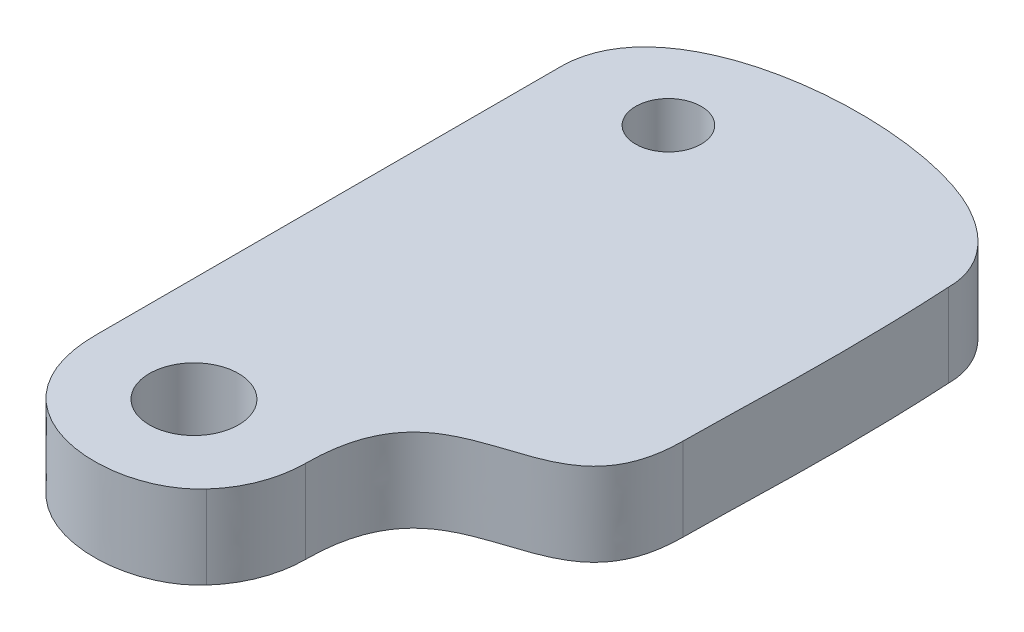
ISO-10303-21;
HEADER;
FILE_DESCRIPTION(('STEP AP214'),'2;1');
FILE_NAME('part.step','',(''),(''),'','','');
FILE_SCHEMA(('AUTOMOTIVE_DESIGN { 1 0 10303 214 1 1 1 1 }'));
ENDSEC;
DATA;
#1=APPLICATION_CONTEXT('core data for automotive mechanical design processes');
#2=APPLICATION_PROTOCOL_DEFINITION('international standard','automotive_design',2000,#1);
#3=PRODUCT_CONTEXT('',#1,'mechanical');
#4=PRODUCT('Part','Part','',(#3));
#5=PRODUCT_RELATED_PRODUCT_CATEGORY('part','',(#4));
#6=PRODUCT_DEFINITION_FORMATION('','',#4);
#7=PRODUCT_DEFINITION_CONTEXT('part definition',#1,'design');
#8=PRODUCT_DEFINITION('design','',#6,#7);
#9=PRODUCT_DEFINITION_SHAPE('','',#8);
#10=(LENGTH_UNIT() NAMED_UNIT(*) SI_UNIT(.MILLI.,.METRE.));
#11=(NAMED_UNIT(*) PLANE_ANGLE_UNIT() SI_UNIT($,.RADIAN.));
#12=(NAMED_UNIT(*) SI_UNIT($,.STERADIAN.) SOLID_ANGLE_UNIT());
#13=UNCERTAINTY_MEASURE_WITH_UNIT(LENGTH_MEASURE(1.E-05),#10,'distance_accuracy_value','');
#14=(GEOMETRIC_REPRESENTATION_CONTEXT(3) GLOBAL_UNCERTAINTY_ASSIGNED_CONTEXT((#13)) GLOBAL_UNIT_ASSIGNED_CONTEXT((#10,
#11,#12)) REPRESENTATION_CONTEXT('',''));
#15=CARTESIAN_POINT('',(0.,0.,0.));
#16=DIRECTION('',(0.,0.,1.));
#17=DIRECTION('',(1.,0.,0.));
#18=AXIS2_PLACEMENT_3D('',#15,#16,#17);
#19=CARTESIAN_POINT('',(-2.2236047776935,3.175,-12.051279994793));
#20=DIRECTION('',(0.,-1.,0.));
#21=DIRECTION('',(0.,0.,-1.));
#22=AXIS2_PLACEMENT_3D('',#19,#20,#21);
#23=PLANE('',#22);
#24=CARTESIAN_POINT('',(5.45684789088382,3.175,-10.9009338807093));
#25=CARTESIAN_POINT('',(2.1069950702008,3.175,-13.0814070921583));
#26=CARTESIAN_POINT('',(-7.38686052094246,3.175,-12.739250306762));
#27=CARTESIAN_POINT('',(-7.40608976020683,3.175,-8.04733388087356));
#28=B_SPLINE_CURVE_WITH_KNOTS('',3,(#24,#25,#26,#27),.UNSPECIFIED.,.F.,.F.,(4,4),(8.,9.),.UNSPECIFIED.);
#29=CARTESIAN_POINT('',(5.45684789088382,3.175,-10.9009338807093));
#30=VERTEX_POINT('',#29);
#31=CARTESIAN_POINT('',(-7.40608976020683,3.175,-8.04733388087356));
#32=VERTEX_POINT('',#31);
#33=EDGE_CURVE('E169',#30,#32,#28,.T.);
#34=ORIENTED_EDGE('',*,*,#33,.T.);
#35=DIRECTION('',(0.,0.,1.));
#36=VECTOR('',#35,1.);
#37=CARTESIAN_POINT('',(-7.40608976020683,3.175,-8.04733388087356));
#38=LINE('',#37,#36);
#39=CARTESIAN_POINT('',(-7.40608976020683,3.175,9.66748498892453));
#40=VERTEX_POINT('',#39);
#41=EDGE_CURVE('E95',#32,#40,#38,.T.);
#42=ORIENTED_EDGE('',*,*,#41,.T.);
#43=CARTESIAN_POINT('',(-7.40608976020683,3.175,9.66748498892453));
#44=CARTESIAN_POINT('',(-7.42744052722012,3.175,14.3592651158673));
#45=CARTESIAN_POINT('',(-2.10497651433928,3.175,14.8223905352442));
#46=CARTESIAN_POINT('',(-0.211157807269164,3.175,12.6847874377914));
#47=B_SPLINE_CURVE_WITH_KNOTS('',3,(#43,#44,#45,#46),.UNSPECIFIED.,.F.,.F.,(4,4),(3.,4.),.UNSPECIFIED.);
#48=CARTESIAN_POINT('',(-0.211157807269164,3.175,12.6847874377914));
#49=VERTEX_POINT('',#48);
#50=EDGE_CURVE('E158',#40,#49,#47,.T.);
#51=ORIENTED_EDGE('',*,*,#50,.T.);
#52=CARTESIAN_POINT('',(-0.211157807269164,3.175,12.6847874377914));
#53=CARTESIAN_POINT('',(0.454759152270997,3.175,11.9615426872701));
#54=CARTESIAN_POINT('',(0.830932646499955,3.175,10.9790548639917));
#55=CARTESIAN_POINT('',(0.834200783631736,3.175,9.95326647209335));
#56=B_SPLINE_CURVE_WITH_KNOTS('',3,(#52,#53,#54,#55),.UNSPECIFIED.,.F.,.F.,(4,4),(4.,5.),.UNSPECIFIED.);
#57=CARTESIAN_POINT('',(0.834200783631736,3.175,9.95326647209335));
#58=VERTEX_POINT('',#57);
#59=EDGE_CURVE('E111',#49,#58,#56,.T.);
#60=ORIENTED_EDGE('',*,*,#59,.T.);
#61=CARTESIAN_POINT('',(0.834200783631737,3.175,9.95326647209335));
#62=CARTESIAN_POINT('',(0.847614911117956,3.175,3.75924435648867));
#63=CARTESIAN_POINT('',(7.27674481797437,3.175,7.46221529024713));
#64=CARTESIAN_POINT('',(7.29975160616193,3.175,2.00896706126397));
#65=B_SPLINE_CURVE_WITH_KNOTS('',3,(#61,#62,#63,#64),.UNSPECIFIED.,.F.,.F.,(4,4),(5.,6.),.UNSPECIFIED.);
#66=CARTESIAN_POINT('',(7.29975160616193,3.175,2.00896706126397));
#67=VERTEX_POINT('',#66);
#68=EDGE_CURVE('E105',#58,#67,#65,.T.);
#69=ORIENTED_EDGE('',*,*,#68,.T.);
#70=CARTESIAN_POINT('',(7.29975160616193,3.175,2.00896706126397));
#71=CARTESIAN_POINT('',(7.31002667173508,3.175,-0.45628155517044));
#72=CARTESIAN_POINT('',(7.5237363351401,3.175,-3.75213448945177));
#73=CARTESIAN_POINT('',(7.27674481867446,3.175,-8.14732126388171));
#74=B_SPLINE_CURVE_WITH_KNOTS('',3,(#70,#71,#72,#73),.UNSPECIFIED.,.F.,.F.,(4,4),(6.,7.),.UNSPECIFIED.);
#75=CARTESIAN_POINT('',(7.27674481867446,3.175,-8.14732126388171));
#76=VERTEX_POINT('',#75);
#77=EDGE_CURVE('E109',#67,#76,#74,.T.);
#78=ORIENTED_EDGE('',*,*,#77,.T.);
#79=CARTESIAN_POINT('',(7.27674481867446,3.175,-8.14732126388171));
#80=CARTESIAN_POINT('',(7.28724612918391,3.175,-9.17306110816555));
#81=CARTESIAN_POINT('',(6.63234001791775,3.175,-10.1636940967594));
#82=CARTESIAN_POINT('',(5.45684789088382,3.175,-10.9009338807093));
#83=B_SPLINE_CURVE_WITH_KNOTS('',3,(#79,#80,#81,#82),.UNSPECIFIED.,.F.,.F.,(4,4),(7.,8.),.UNSPECIFIED.);
#84=EDGE_CURVE('E55',#76,#30,#83,.T.);
#85=ORIENTED_EDGE('',*,*,#84,.T.);
#86=EDGE_LOOP('',(#34,#42,#51,#60,#69,#78,#85));
#87=FACE_BOUND('',#86,.T.);
#88=CARTESIAN_POINT('',(-3.41317397574345,3.175,9.95316880889974));
#89=DIRECTION('',(0.,1.,0.));
#90=DIRECTION('',(0.,0.,1.));
#91=AXIS2_PLACEMENT_3D('',#88,#89,#90);
#92=CIRCLE('',#91,1.7);
#93=CARTESIAN_POINT('',(-3.41317397574345,3.175,11.6531688088997));
#94=VERTEX_POINT('',#93);
#95=EDGE_CURVE('E180',#94,#94,#92,.T.);
#96=ORIENTED_EDGE('',*,*,#95,.F.);
#97=EDGE_LOOP('',(#96));
#98=FACE_BOUND('',#97,.T.);
#99=CARTESIAN_POINT('',(-3.41327146132212,3.175,-8.14732126442139));
#100=DIRECTION('',(0.,1.,0.));
#101=DIRECTION('',(0.,0.,1.));
#102=AXIS2_PLACEMENT_3D('',#99,#100,#101);
#103=CIRCLE('',#102,1.25);
#104=CARTESIAN_POINT('',(-3.41327146132212,3.175,-6.89732126442139));
#105=VERTEX_POINT('',#104);
#106=EDGE_CURVE('E181',#105,#105,#103,.T.);
#107=ORIENTED_EDGE('',*,*,#106,.F.);
#108=EDGE_LOOP('',(#107));
#109=FACE_BOUND('',#108,.T.);
#110=ADVANCED_FACE('F37',(#87,#98,#109),#23,.F.);
#111=CARTESIAN_POINT('',(-2.2236047776935,0.,-12.051279994793));
#112=DIRECTION('',(0.,-1.,0.));
#113=DIRECTION('',(0.,0.,-1.));
#114=AXIS2_PLACEMENT_3D('',#111,#112,#113);
#115=PLANE('',#114);
#116=CARTESIAN_POINT('',(-3.41317397574345,0.,9.95316880889974));
#117=DIRECTION('',(0.,1.,0.));
#118=DIRECTION('',(0.,0.,1.));
#119=AXIS2_PLACEMENT_3D('',#116,#117,#118);
#120=CIRCLE('',#119,1.7);
#121=CARTESIAN_POINT('',(-3.41317397574345,0.,11.6531688088997));
#122=VERTEX_POINT('',#121);
#123=EDGE_CURVE('E174',#122,#122,#120,.T.);
#124=ORIENTED_EDGE('',*,*,#123,.T.);
#125=EDGE_LOOP('',(#124));
#126=FACE_BOUND('',#125,.T.);
#127=CARTESIAN_POINT('',(5.45684789088382,0.,-10.9009338807093));
#128=CARTESIAN_POINT('',(2.1069950702008,0.,-13.0814070921583));
#129=CARTESIAN_POINT('',(-7.38686052094246,0.,-12.739250306762));
#130=CARTESIAN_POINT('',(-7.40608976020683,0.,-8.04733388087356));
#131=B_SPLINE_CURVE_WITH_KNOTS('',3,(#127,#128,#129,#130),.UNSPECIFIED.,.F.,.F.,(4,4),(8.,9.),.UNSPECIFIED.);
#132=CARTESIAN_POINT('',(5.45684789088382,0.,-10.9009338807093));
#133=VERTEX_POINT('',#132);
#134=CARTESIAN_POINT('',(-7.40608976020683,0.,-8.04733388087356));
#135=VERTEX_POINT('',#134);
#136=EDGE_CURVE('E184',#133,#135,#131,.T.);
#137=ORIENTED_EDGE('',*,*,#136,.F.);
#138=CARTESIAN_POINT('',(7.27674481867446,0.,-8.14732126388171));
#139=CARTESIAN_POINT('',(7.28724612918391,0.,-9.17306110816555));
#140=CARTESIAN_POINT('',(6.63234001791775,0.,-10.1636940967594));
#141=CARTESIAN_POINT('',(5.45684789088382,0.,-10.9009338807093));
#142=B_SPLINE_CURVE_WITH_KNOTS('',3,(#138,#139,#140,#141),.UNSPECIFIED.,.F.,.F.,(4,4),(7.,8.),.UNSPECIFIED.);
#143=CARTESIAN_POINT('',(7.27674481867446,0.,-8.14732126388171));
#144=VERTEX_POINT('',#143);
#145=EDGE_CURVE('E87',#144,#133,#142,.T.);
#146=ORIENTED_EDGE('',*,*,#145,.F.);
#147=CARTESIAN_POINT('',(7.29975160616193,0.,2.00896706126397));
#148=CARTESIAN_POINT('',(7.31002667173508,0.,-0.45628155517044));
#149=CARTESIAN_POINT('',(7.5237363351401,0.,-3.75213448945177));
#150=CARTESIAN_POINT('',(7.27674481867446,0.,-8.14732126388171));
#151=B_SPLINE_CURVE_WITH_KNOTS('',3,(#147,#148,#149,#150),.UNSPECIFIED.,.F.,.F.,(4,4),(6.,7.),.UNSPECIFIED.);
#152=CARTESIAN_POINT('',(7.29975160616193,0.,2.00896706126397));
#153=VERTEX_POINT('',#152);
#154=EDGE_CURVE('E81',#153,#144,#151,.T.);
#155=ORIENTED_EDGE('',*,*,#154,.F.);
#156=CARTESIAN_POINT('',(0.834200783631737,0.,9.95326647209335));
#157=CARTESIAN_POINT('',(0.847614911117956,0.,3.75924435648867));
#158=CARTESIAN_POINT('',(7.27674481797437,0.,7.46221529024713));
#159=CARTESIAN_POINT('',(7.29975160616193,0.,2.00896706126397));
#160=B_SPLINE_CURVE_WITH_KNOTS('',3,(#156,#157,#158,#159),.UNSPECIFIED.,.F.,.F.,(4,4),(5.,6.),.UNSPECIFIED.);
#161=CARTESIAN_POINT('',(0.834200783631736,0.,9.95326647209335));
#162=VERTEX_POINT('',#161);
#163=EDGE_CURVE('E119',#162,#153,#160,.T.);
#164=ORIENTED_EDGE('',*,*,#163,.F.);
#165=CARTESIAN_POINT('',(-0.211157807269164,0.,12.6847874377914));
#166=CARTESIAN_POINT('',(0.454759152270997,0.,11.9615426872701));
#167=CARTESIAN_POINT('',(0.830932646499955,0.,10.9790548639917));
#168=CARTESIAN_POINT('',(0.834200783631736,0.,9.95326647209335));
#169=B_SPLINE_CURVE_WITH_KNOTS('',3,(#165,#166,#167,#168),.UNSPECIFIED.,.F.,.F.,(4,4),(4.,5.),.UNSPECIFIED.);
#170=CARTESIAN_POINT('',(-0.211157807269164,0.,12.6847874377914));
#171=VERTEX_POINT('',#170);
#172=EDGE_CURVE('E297',#171,#162,#169,.T.);
#173=ORIENTED_EDGE('',*,*,#172,.F.);
#174=CARTESIAN_POINT('',(-7.40608976020683,0.,9.66748498892453));
#175=CARTESIAN_POINT('',(-7.42744052722012,0.,14.3592651158673));
#176=CARTESIAN_POINT('',(-2.10497651433928,0.,14.8223905352442));
#177=CARTESIAN_POINT('',(-0.211157807269164,0.,12.6847874377914));
#178=B_SPLINE_CURVE_WITH_KNOTS('',3,(#174,#175,#176,#177),.UNSPECIFIED.,.F.,.F.,(4,4),(3.,4.),.UNSPECIFIED.);
#179=CARTESIAN_POINT('',(-7.40608976020683,0.,9.66748498892453));
#180=VERTEX_POINT('',#179);
#181=EDGE_CURVE('E286',#180,#171,#178,.T.);
#182=ORIENTED_EDGE('',*,*,#181,.F.);
#183=DIRECTION('',(0.,0.,1.));
#184=VECTOR('',#183,1.);
#185=CARTESIAN_POINT('',(-7.40608976020683,0.,-8.04733388087356));
#186=LINE('',#185,#184);
#187=EDGE_CURVE('E285',#135,#180,#186,.T.);
#188=ORIENTED_EDGE('',*,*,#187,.F.);
#189=EDGE_LOOP('',(#137,#146,#155,#164,#173,#182,#188));
#190=FACE_BOUND('',#189,.T.);
#191=CARTESIAN_POINT('',(-3.41327146132212,0.,-8.14732126442139));
#192=DIRECTION('',(0.,1.,0.));
#193=DIRECTION('',(0.,0.,1.));
#194=AXIS2_PLACEMENT_3D('',#191,#192,#193);
#195=CIRCLE('',#194,1.25);
#196=CARTESIAN_POINT('',(-3.41327146132212,0.,-6.89732126442139));
#197=VERTEX_POINT('',#196);
#198=EDGE_CURVE('E185',#197,#197,#195,.T.);
#199=ORIENTED_EDGE('',*,*,#198,.T.);
#200=EDGE_LOOP('',(#199));
#201=FACE_BOUND('',#200,.T.);
#202=ADVANCED_FACE('F195',(#126,#190,#201),#115,.T.);
#203=DIRECTION('',(0.,-1.,0.));
#204=VECTOR('',#203,1.);
#205=SURFACE_OF_LINEAR_EXTRUSION('',#28,#204);
#206=ORIENTED_EDGE('',*,*,#136,.T.);
#207=DIRECTION('',(0.,-1.,0.));
#208=VECTOR('',#207,1.);
#209=CARTESIAN_POINT('',(-7.40608976020683,3.175,-8.04733388087356));
#210=LINE('',#209,#208);
#211=EDGE_CURVE('E11',#32,#135,#210,.T.);
#212=ORIENTED_EDGE('',*,*,#211,.F.);
#213=ORIENTED_EDGE('',*,*,#33,.F.);
#214=DIRECTION('',(0.,-1.,0.));
#215=VECTOR('',#214,1.);
#216=CARTESIAN_POINT('',(5.45684789088382,3.175,-10.9009338807093));
#217=LINE('',#216,#215);
#218=EDGE_CURVE('E125',#30,#133,#217,.T.);
#219=ORIENTED_EDGE('',*,*,#218,.T.);
#220=EDGE_LOOP('',(#206,#212,#213,#219));
#221=FACE_BOUND('',#220,.T.);
#222=ADVANCED_FACE('F39',(#221),#205,.F.);
#223=CARTESIAN_POINT('',(-7.40608976020683,3.175,-8.04733388087356));
#224=DIRECTION('',(1.,0.,0.));
#225=DIRECTION('',(0.,0.,-1.));
#226=AXIS2_PLACEMENT_3D('',#223,#224,#225);
#227=PLANE('',#226);
#228=ORIENTED_EDGE('',*,*,#187,.T.);
#229=DIRECTION('',(0.,-1.,0.));
#230=VECTOR('',#229,1.);
#231=CARTESIAN_POINT('',(-7.40608976020683,3.175,9.66748498892453));
#232=LINE('',#231,#230);
#233=EDGE_CURVE('E47',#40,#180,#232,.T.);
#234=ORIENTED_EDGE('',*,*,#233,.F.);
#235=ORIENTED_EDGE('',*,*,#41,.F.);
#236=ORIENTED_EDGE('',*,*,#211,.T.);
#237=EDGE_LOOP('',(#228,#234,#235,#236));
#238=FACE_BOUND('',#237,.T.);
#239=ADVANCED_FACE('F236',(#238),#227,.F.);
#240=DIRECTION('',(0.,-1.,0.));
#241=VECTOR('',#240,1.);
#242=SURFACE_OF_LINEAR_EXTRUSION('',#47,#241);
#243=ORIENTED_EDGE('',*,*,#181,.T.);
#244=DIRECTION('',(0.,-1.,0.));
#245=VECTOR('',#244,1.);
#246=CARTESIAN_POINT('',(-0.211157807269164,3.175,12.6847874377914));
#247=LINE('',#246,#245);
#248=EDGE_CURVE('E328',#49,#171,#247,.T.);
#249=ORIENTED_EDGE('',*,*,#248,.F.);
#250=ORIENTED_EDGE('',*,*,#50,.F.);
#251=ORIENTED_EDGE('',*,*,#233,.T.);
#252=EDGE_LOOP('',(#243,#249,#250,#251));
#253=FACE_BOUND('',#252,.T.);
#254=ADVANCED_FACE('F152',(#253),#242,.F.);
#255=DIRECTION('',(0.,-1.,0.));
#256=VECTOR('',#255,1.);
#257=SURFACE_OF_LINEAR_EXTRUSION('',#56,#256);
#258=ORIENTED_EDGE('',*,*,#172,.T.);
#259=DIRECTION('',(0.,-1.,0.));
#260=VECTOR('',#259,1.);
#261=CARTESIAN_POINT('',(0.834200783631736,3.175,9.95326647209335));
#262=LINE('',#261,#260);
#263=EDGE_CURVE('E120',#58,#162,#262,.T.);
#264=ORIENTED_EDGE('',*,*,#263,.F.);
#265=ORIENTED_EDGE('',*,*,#59,.F.);
#266=ORIENTED_EDGE('',*,*,#248,.T.);
#267=EDGE_LOOP('',(#258,#264,#265,#266));
#268=FACE_BOUND('',#267,.T.);
#269=ADVANCED_FACE('F149',(#268),#257,.F.);
#270=DIRECTION('',(0.,-1.,0.));
#271=VECTOR('',#270,1.);
#272=SURFACE_OF_LINEAR_EXTRUSION('',#65,#271);
#273=ORIENTED_EDGE('',*,*,#163,.T.);
#274=DIRECTION('',(0.,-1.,0.));
#275=VECTOR('',#274,1.);
#276=CARTESIAN_POINT('',(7.29975160616193,3.175,2.00896706126397));
#277=LINE('',#276,#275);
#278=EDGE_CURVE('E116',#67,#153,#277,.T.);
#279=ORIENTED_EDGE('',*,*,#278,.F.);
#280=ORIENTED_EDGE('',*,*,#68,.F.);
#281=ORIENTED_EDGE('',*,*,#263,.T.);
#282=EDGE_LOOP('',(#273,#279,#280,#281));
#283=FACE_BOUND('',#282,.T.);
#284=ADVANCED_FACE('F117',(#283),#272,.F.);
#285=DIRECTION('',(0.,-1.,0.));
#286=VECTOR('',#285,1.);
#287=SURFACE_OF_LINEAR_EXTRUSION('',#74,#286);
#288=ORIENTED_EDGE('',*,*,#154,.T.);
#289=DIRECTION('',(0.,-1.,0.));
#290=VECTOR('',#289,1.);
#291=CARTESIAN_POINT('',(7.27674481867446,3.175,-8.14732126388171));
#292=LINE('',#291,#290);
#293=EDGE_CURVE('E121',#76,#144,#292,.T.);
#294=ORIENTED_EDGE('',*,*,#293,.F.);
#295=ORIENTED_EDGE('',*,*,#77,.F.);
#296=ORIENTED_EDGE('',*,*,#278,.T.);
#297=EDGE_LOOP('',(#288,#294,#295,#296));
#298=FACE_BOUND('',#297,.T.);
#299=ADVANCED_FACE('F123',(#298),#287,.F.);
#300=DIRECTION('',(0.,-1.,0.));
#301=VECTOR('',#300,1.);
#302=SURFACE_OF_LINEAR_EXTRUSION('',#83,#301);
#303=ORIENTED_EDGE('',*,*,#145,.T.);
#304=ORIENTED_EDGE('',*,*,#218,.F.);
#305=ORIENTED_EDGE('',*,*,#84,.F.);
#306=ORIENTED_EDGE('',*,*,#293,.T.);
#307=EDGE_LOOP('',(#303,#304,#305,#306));
#308=FACE_BOUND('',#307,.T.);
#309=ADVANCED_FACE('F145',(#308),#302,.F.);
#310=CARTESIAN_POINT('',(-3.41317397574345,3.175,9.95316880889974));
#311=DIRECTION('',(0.,-1.,0.));
#312=DIRECTION('',(0.,0.,-1.));
#313=AXIS2_PLACEMENT_3D('',#310,#311,#312);
#314=CYLINDRICAL_SURFACE('',#313,1.7);
#315=ORIENTED_EDGE('',*,*,#95,.T.);
#316=EDGE_LOOP('',(#315));
#317=FACE_BOUND('',#316,.T.);
#318=ORIENTED_EDGE('',*,*,#123,.F.);
#319=EDGE_LOOP('',(#318));
#320=FACE_BOUND('',#319,.T.);
#321=ADVANCED_FACE('F202',(#317,#320),#314,.F.);
#322=CARTESIAN_POINT('',(-3.41327146132212,3.175,-8.14732126442139));
#323=DIRECTION('',(0.,-1.,0.));
#324=DIRECTION('',(0.,0.,-1.));
#325=AXIS2_PLACEMENT_3D('',#322,#323,#324);
#326=CYLINDRICAL_SURFACE('',#325,1.25);
#327=ORIENTED_EDGE('',*,*,#106,.T.);
#328=EDGE_LOOP('',(#327));
#329=FACE_BOUND('',#328,.T.);
#330=ORIENTED_EDGE('',*,*,#198,.F.);
#331=EDGE_LOOP('',(#330));
#332=FACE_BOUND('',#331,.T.);
#333=ADVANCED_FACE('F191',(#329,#332),#326,.F.);
#334=CLOSED_SHELL('',(#110,#202,#222,#239,#254,#269,#284,#299,#309,#321,#333));
#335=MANIFOLD_SOLID_BREP('B2',#334);
#336=ADVANCED_BREP_SHAPE_REPRESENTATION('',(#18,#335),#14);
#337=SHAPE_DEFINITION_REPRESENTATION(#9,#336);
ENDSEC;
END-ISO-10303-21;
